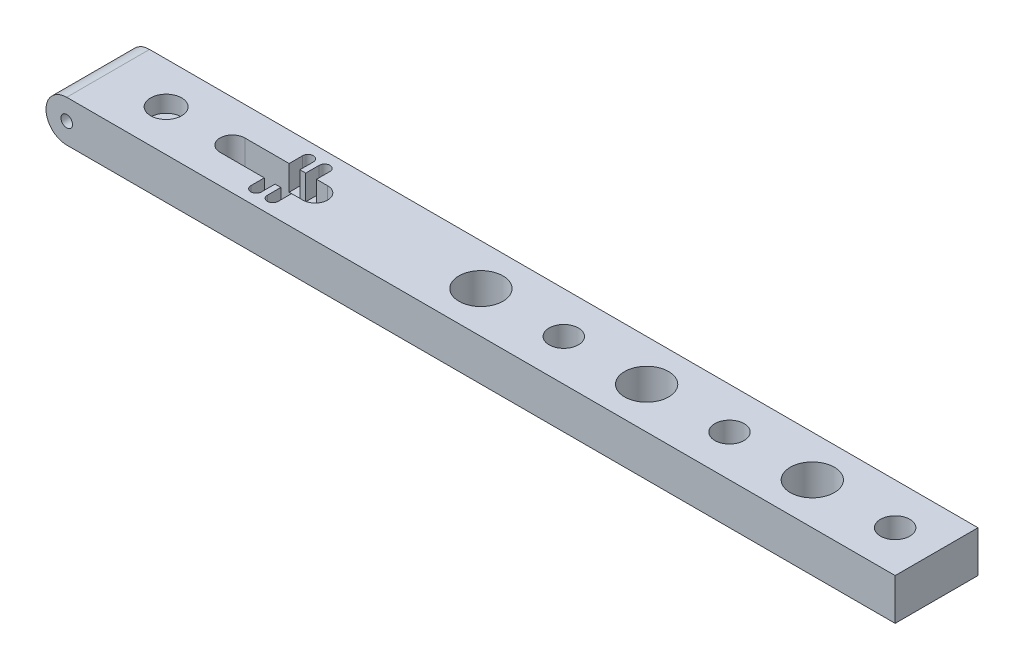
ISO-10303-21;
HEADER;
FILE_DESCRIPTION(('STEP AP214'),'2;1');
FILE_NAME('part.step','',(''),(''),'','','');
FILE_SCHEMA(('AUTOMOTIVE_DESIGN { 1 0 10303 214 1 1 1 1 }'));
ENDSEC;
DATA;
#1=APPLICATION_CONTEXT('core data for automotive mechanical design processes');
#2=APPLICATION_PROTOCOL_DEFINITION('international standard','automotive_design',2000,#1);
#3=PRODUCT_CONTEXT('',#1,'mechanical');
#4=PRODUCT('Part','Part','',(#3));
#5=PRODUCT_RELATED_PRODUCT_CATEGORY('part','',(#4));
#6=PRODUCT_DEFINITION_FORMATION('','',#4);
#7=PRODUCT_DEFINITION_CONTEXT('part definition',#1,'design');
#8=PRODUCT_DEFINITION('design','',#6,#7);
#9=PRODUCT_DEFINITION_SHAPE('','',#8);
#10=(LENGTH_UNIT() NAMED_UNIT(*) SI_UNIT(.MILLI.,.METRE.));
#11=(NAMED_UNIT(*) PLANE_ANGLE_UNIT() SI_UNIT($,.RADIAN.));
#12=(NAMED_UNIT(*) SI_UNIT($,.STERADIAN.) SOLID_ANGLE_UNIT());
#13=UNCERTAINTY_MEASURE_WITH_UNIT(LENGTH_MEASURE(1.E-05),#10,'distance_accuracy_value','');
#14=(GEOMETRIC_REPRESENTATION_CONTEXT(3) GLOBAL_UNCERTAINTY_ASSIGNED_CONTEXT((#13)) GLOBAL_UNIT_ASSIGNED_CONTEXT((#10,
#11,#12)) REPRESENTATION_CONTEXT('',''));
#15=CARTESIAN_POINT('',(0.,0.,0.));
#16=DIRECTION('',(0.,0.,1.));
#17=DIRECTION('',(1.,0.,0.));
#18=AXIS2_PLACEMENT_3D('',#15,#16,#17);
#19=CARTESIAN_POINT('',(8.89,6.35,6.35));
#20=DIRECTION('',(0.,1.,0.));
#21=DIRECTION('',(0.,0.,1.));
#22=AXIS2_PLACEMENT_3D('',#19,#20,#21);
#23=CYLINDRICAL_SURFACE('',#22,0.888999999999999);
#24=CARTESIAN_POINT('',(8.89,0.,6.35));
#25=DIRECTION('',(0.,1.,0.));
#26=DIRECTION('',(0.,0.,1.));
#27=AXIS2_PLACEMENT_3D('',#24,#25,#26);
#28=CIRCLE('',#27,0.888999999999999);
#29=CARTESIAN_POINT('',(8.89,0.,7.239));
#30=VERTEX_POINT('',#29);
#31=EDGE_CURVE('E244',#30,#30,#28,.T.);
#32=ORIENTED_EDGE('',*,*,#31,.F.);
#33=EDGE_LOOP('',(#32));
#34=FACE_BOUND('',#33,.T.);
#35=CARTESIAN_POINT('',(8.89,3.81,6.35));
#36=DIRECTION('',(0.,1.,0.));
#37=DIRECTION('',(0.,0.,1.));
#38=AXIS2_PLACEMENT_3D('',#35,#36,#37);
#39=CIRCLE('',#38,0.888999999999999);
#40=CARTESIAN_POINT('',(8.89,3.81,7.239));
#41=VERTEX_POINT('',#40);
#42=EDGE_CURVE('E45',#41,#41,#39,.F.);
#43=ORIENTED_EDGE('',*,*,#42,.F.);
#44=EDGE_LOOP('',(#43));
#45=FACE_BOUND('',#44,.T.);
#46=ADVANCED_FACE('F41',(#34,#45),#23,.F.);
#47=CARTESIAN_POINT('',(0.,6.35,12.7));
#48=DIRECTION('',(0.,-1.,0.));
#49=DIRECTION('',(0.,0.,-1.));
#50=AXIS2_PLACEMENT_3D('',#47,#48,#49);
#51=PLANE('',#50);
#52=CARTESIAN_POINT('',(8.89,6.35,6.35));
#53=DIRECTION('',(0.,1.,0.));
#54=DIRECTION('',(0.,0.,1.));
#55=AXIS2_PLACEMENT_3D('',#52,#53,#54);
#56=CIRCLE('',#55,2.38125);
#57=CARTESIAN_POINT('',(8.89,6.35,8.73125));
#58=VERTEX_POINT('',#57);
#59=EDGE_CURVE('E532',#58,#58,#56,.T.);
#60=ORIENTED_EDGE('',*,*,#59,.F.);
#61=EDGE_LOOP('',(#60));
#62=FACE_BOUND('',#61,.T.);
#63=CARTESIAN_POINT('',(57.15,6.35,6.35));
#64=DIRECTION('',(0.,1.,0.));
#65=DIRECTION('',(0.,0.,1.));
#66=AXIS2_PLACEMENT_3D('',#63,#64,#65);
#67=CIRCLE('',#66,3.3782);
#68=CARTESIAN_POINT('',(57.15,6.35,9.7282));
#69=VERTEX_POINT('',#68);
#70=EDGE_CURVE('E522',#69,#69,#67,.T.);
#71=ORIENTED_EDGE('',*,*,#70,.F.);
#72=EDGE_LOOP('',(#71));
#73=FACE_BOUND('',#72,.T.);
#74=CARTESIAN_POINT('',(82.55,6.35,6.35));
#75=DIRECTION('',(0.,1.,0.));
#76=DIRECTION('',(0.,0.,1.));
#77=AXIS2_PLACEMENT_3D('',#74,#75,#76);
#78=CIRCLE('',#77,3.3782);
#79=CARTESIAN_POINT('',(82.55,6.35,9.7282));
#80=VERTEX_POINT('',#79);
#81=EDGE_CURVE('E514',#80,#80,#78,.T.);
#82=ORIENTED_EDGE('',*,*,#81,.F.);
#83=EDGE_LOOP('',(#82));
#84=FACE_BOUND('',#83,.T.);
#85=CARTESIAN_POINT('',(69.85,6.35,6.35));
#86=DIRECTION('',(0.,1.,0.));
#87=DIRECTION('',(0.,0.,1.));
#88=AXIS2_PLACEMENT_3D('',#85,#86,#87);
#89=CIRCLE('',#88,2.2479);
#90=CARTESIAN_POINT('',(69.85,6.35,8.5979));
#91=VERTEX_POINT('',#90);
#92=EDGE_CURVE('E506',#91,#91,#89,.T.);
#93=ORIENTED_EDGE('',*,*,#92,.F.);
#94=EDGE_LOOP('',(#93));
#95=FACE_BOUND('',#94,.T.);
#96=CARTESIAN_POINT('',(95.25,6.35,6.35));
#97=DIRECTION('',(0.,1.,0.));
#98=DIRECTION('',(0.,0.,1.));
#99=AXIS2_PLACEMENT_3D('',#96,#97,#98);
#100=CIRCLE('',#99,2.2479);
#101=CARTESIAN_POINT('',(95.25,6.35,8.5979));
#102=VERTEX_POINT('',#101);
#103=EDGE_CURVE('E498',#102,#102,#100,.T.);
#104=ORIENTED_EDGE('',*,*,#103,.F.);
#105=EDGE_LOOP('',(#104));
#106=FACE_BOUND('',#105,.T.);
#107=DIRECTION('',(-1.,0.,0.));
#108=VECTOR('',#107,1.);
#109=CARTESIAN_POINT('',(19.05,6.35,4.445));
#110=LINE('',#109,#108);
#111=CARTESIAN_POINT('',(28.3845,6.35,4.445));
#112=VERTEX_POINT('',#111);
#113=CARTESIAN_POINT('',(27.4955,6.35,4.445));
#114=VERTEX_POINT('',#113);
#115=EDGE_CURVE('E371',#112,#114,#110,.T.);
#116=ORIENTED_EDGE('',*,*,#115,.F.);
#117=DIRECTION('',(0.,0.,1.));
#118=VECTOR('',#117,1.);
#119=CARTESIAN_POINT('',(28.3845,6.35,10.31875));
#120=LINE('',#119,#118);
#121=CARTESIAN_POINT('',(28.3845,6.35,2.38125));
#122=VERTEX_POINT('',#121);
#123=EDGE_CURVE('E237',#122,#112,#120,.T.);
#124=ORIENTED_EDGE('',*,*,#123,.F.);
#125=CARTESIAN_POINT('',(29.21,6.35,2.38125));
#126=DIRECTION('',(0.,1.,0.));
#127=DIRECTION('',(0.,0.,1.));
#128=AXIS2_PLACEMENT_3D('',#125,#126,#127);
#129=CIRCLE('',#128,0.8255);
#130=CARTESIAN_POINT('',(30.0355,6.35,2.38125));
#131=VERTEX_POINT('',#130);
#132=EDGE_CURVE('E258',#131,#122,#129,.T.);
#133=ORIENTED_EDGE('',*,*,#132,.F.);
#134=DIRECTION('',(0.,0.,-1.));
#135=VECTOR('',#134,1.);
#136=CARTESIAN_POINT('',(30.0355,6.35,10.31875));
#137=LINE('',#136,#135);
#138=CARTESIAN_POINT('',(30.0355,6.35,4.445));
#139=VERTEX_POINT('',#138);
#140=EDGE_CURVE('E253',#139,#131,#137,.T.);
#141=ORIENTED_EDGE('',*,*,#140,.F.);
#142=CARTESIAN_POINT('',(31.75,6.35,4.445));
#143=VERTEX_POINT('',#142);
#144=EDGE_CURVE('E342',#143,#139,#110,.T.);
#145=ORIENTED_EDGE('',*,*,#144,.F.);
#146=CARTESIAN_POINT('',(31.75,6.35,6.35));
#147=DIRECTION('',(0.,1.,0.));
#148=DIRECTION('',(0.,0.,1.));
#149=AXIS2_PLACEMENT_3D('',#146,#147,#148);
#150=CIRCLE('',#149,1.905);
#151=CARTESIAN_POINT('',(31.75,6.35,8.255));
#152=VERTEX_POINT('',#151);
#153=EDGE_CURVE('E362',#152,#143,#150,.T.);
#154=ORIENTED_EDGE('',*,*,#153,.F.);
#155=DIRECTION('',(1.,0.,0.));
#156=VECTOR('',#155,1.);
#157=CARTESIAN_POINT('',(19.05,6.35,8.255));
#158=LINE('',#157,#156);
#159=CARTESIAN_POINT('',(30.0355,6.35,8.255));
#160=VERTEX_POINT('',#159);
#161=EDGE_CURVE('E357',#160,#152,#158,.T.);
#162=ORIENTED_EDGE('',*,*,#161,.F.);
#163=CARTESIAN_POINT('',(30.0355,6.35,10.31875));
#164=VERTEX_POINT('',#163);
#165=EDGE_CURVE('E255',#164,#160,#137,.T.);
#166=ORIENTED_EDGE('',*,*,#165,.F.);
#167=CARTESIAN_POINT('',(29.21,6.35,10.31875));
#168=DIRECTION('',(0.,1.,0.));
#169=DIRECTION('',(0.,0.,1.));
#170=AXIS2_PLACEMENT_3D('',#167,#168,#169);
#171=CIRCLE('',#170,0.8255);
#172=CARTESIAN_POINT('',(28.3845,6.35,10.31875));
#173=VERTEX_POINT('',#172);
#174=EDGE_CURVE('E216',#173,#164,#171,.T.);
#175=ORIENTED_EDGE('',*,*,#174,.F.);
#176=CARTESIAN_POINT('',(28.3845,6.35,8.255));
#177=VERTEX_POINT('',#176);
#178=EDGE_CURVE('E241',#177,#173,#120,.T.);
#179=ORIENTED_EDGE('',*,*,#178,.F.);
#180=CARTESIAN_POINT('',(27.4955,6.35,8.255));
#181=VERTEX_POINT('',#180);
#182=EDGE_CURVE('E363',#181,#177,#158,.T.);
#183=ORIENTED_EDGE('',*,*,#182,.F.);
#184=DIRECTION('',(0.,0.,-1.));
#185=VECTOR('',#184,1.);
#186=CARTESIAN_POINT('',(27.4955,6.35,10.31875));
#187=LINE('',#186,#185);
#188=CARTESIAN_POINT('',(27.4955,6.35,10.31875));
#189=VERTEX_POINT('',#188);
#190=EDGE_CURVE('E293',#189,#181,#187,.T.);
#191=ORIENTED_EDGE('',*,*,#190,.F.);
#192=CARTESIAN_POINT('',(26.67,6.35,10.31875));
#193=DIRECTION('',(0.,1.,0.));
#194=DIRECTION('',(0.,0.,1.));
#195=AXIS2_PLACEMENT_3D('',#192,#193,#194);
#196=CIRCLE('',#195,0.8255);
#197=CARTESIAN_POINT('',(25.8445,6.35,10.31875));
#198=VERTEX_POINT('',#197);
#199=EDGE_CURVE('E288',#198,#189,#196,.T.);
#200=ORIENTED_EDGE('',*,*,#199,.F.);
#201=DIRECTION('',(0.,0.,1.));
#202=VECTOR('',#201,1.);
#203=CARTESIAN_POINT('',(25.8445,6.35,10.31875));
#204=LINE('',#203,#202);
#205=CARTESIAN_POINT('',(25.8445,6.35,8.255));
#206=VERTEX_POINT('',#205);
#207=EDGE_CURVE('E300',#206,#198,#204,.T.);
#208=ORIENTED_EDGE('',*,*,#207,.F.);
#209=CARTESIAN_POINT('',(19.05,6.35,8.255));
#210=VERTEX_POINT('',#209);
#211=EDGE_CURVE('E358',#210,#206,#158,.T.);
#212=ORIENTED_EDGE('',*,*,#211,.F.);
#213=CARTESIAN_POINT('',(19.05,6.35,6.35));
#214=DIRECTION('',(0.,1.,0.));
#215=DIRECTION('',(0.,0.,1.));
#216=AXIS2_PLACEMENT_3D('',#213,#214,#215);
#217=CIRCLE('',#216,1.905);
#218=CARTESIAN_POINT('',(19.05,6.35,4.445));
#219=VERTEX_POINT('',#218);
#220=EDGE_CURVE('E336',#219,#210,#217,.T.);
#221=ORIENTED_EDGE('',*,*,#220,.F.);
#222=CARTESIAN_POINT('',(25.8445,6.35,4.445));
#223=VERTEX_POINT('',#222);
#224=EDGE_CURVE('E367',#223,#219,#110,.T.);
#225=ORIENTED_EDGE('',*,*,#224,.F.);
#226=CARTESIAN_POINT('',(25.8445,6.35,2.38125));
#227=VERTEX_POINT('',#226);
#228=EDGE_CURVE('E277',#227,#223,#204,.T.);
#229=ORIENTED_EDGE('',*,*,#228,.F.);
#230=CARTESIAN_POINT('',(26.67,6.35,2.38125));
#231=DIRECTION('',(0.,1.,0.));
#232=DIRECTION('',(0.,0.,1.));
#233=AXIS2_PLACEMENT_3D('',#230,#231,#232);
#234=CIRCLE('',#233,0.8255);
#235=CARTESIAN_POINT('',(27.4955,6.35,2.38125));
#236=VERTEX_POINT('',#235);
#237=EDGE_CURVE('E296',#236,#227,#234,.T.);
#238=ORIENTED_EDGE('',*,*,#237,.F.);
#239=EDGE_CURVE('E292',#114,#236,#187,.T.);
#240=ORIENTED_EDGE('',*,*,#239,.F.);
#241=EDGE_LOOP('',(#116,#124,#133,#141,#145,#154,#162,#166,#175,#179,#183,#191,#200,#208,#212,
#221,#225,#229,#238,#240));
#242=FACE_BOUND('',#241,.T.);
#243=DIRECTION('',(-1.,0.,0.));
#244=VECTOR('',#243,1.);
#245=CARTESIAN_POINT('',(0.,6.35,0.));
#246=LINE('',#245,#244);
#247=CARTESIAN_POINT('',(127.,6.35,0.));
#248=VERTEX_POINT('',#247);
#249=CARTESIAN_POINT('',(0.,6.35,0.));
#250=VERTEX_POINT('',#249);
#251=EDGE_CURVE('E400',#248,#250,#246,.T.);
#252=ORIENTED_EDGE('',*,*,#251,.T.);
#253=DIRECTION('',(0.,0.,-1.));
#254=VECTOR('',#253,1.);
#255=CARTESIAN_POINT('',(0.,6.35,12.7));
#256=LINE('',#255,#254);
#257=CARTESIAN_POINT('',(0.,6.35,12.7));
#258=VERTEX_POINT('',#257);
#259=EDGE_CURVE('E409',#258,#250,#256,.T.);
#260=ORIENTED_EDGE('',*,*,#259,.F.);
#261=DIRECTION('',(-1.,0.,0.));
#262=VECTOR('',#261,1.);
#263=CARTESIAN_POINT('',(0.,6.35,12.7));
#264=LINE('',#263,#262);
#265=CARTESIAN_POINT('',(127.,6.35,12.7));
#266=VERTEX_POINT('',#265);
#267=EDGE_CURVE('E406',#266,#258,#264,.T.);
#268=ORIENTED_EDGE('',*,*,#267,.F.);
#269=DIRECTION('',(0.,0.,-1.));
#270=VECTOR('',#269,1.);
#271=CARTESIAN_POINT('',(127.,6.35,12.7));
#272=LINE('',#271,#270);
#273=EDGE_CURVE('E424',#266,#248,#272,.T.);
#274=ORIENTED_EDGE('',*,*,#273,.T.);
#275=EDGE_LOOP('',(#252,#260,#268,#274));
#276=FACE_BOUND('',#275,.T.);
#277=CARTESIAN_POINT('',(120.65,6.35,6.35));
#278=DIRECTION('',(0.,1.,0.));
#279=DIRECTION('',(0.,0.,1.));
#280=AXIS2_PLACEMENT_3D('',#277,#278,#279);
#281=CIRCLE('',#280,2.2479);
#282=CARTESIAN_POINT('',(120.65,6.35,8.5979));
#283=VERTEX_POINT('',#282);
#284=EDGE_CURVE('E483',#283,#283,#281,.T.);
#285=ORIENTED_EDGE('',*,*,#284,.F.);
#286=EDGE_LOOP('',(#285));
#287=FACE_BOUND('',#286,.T.);
#288=CARTESIAN_POINT('',(107.95,6.35,6.35));
#289=DIRECTION('',(0.,1.,0.));
#290=DIRECTION('',(0.,0.,1.));
#291=AXIS2_PLACEMENT_3D('',#288,#289,#290);
#292=CIRCLE('',#291,3.3782);
#293=CARTESIAN_POINT('',(107.95,6.35,9.7282));
#294=VERTEX_POINT('',#293);
#295=EDGE_CURVE('E490',#294,#294,#292,.T.);
#296=ORIENTED_EDGE('',*,*,#295,.F.);
#297=EDGE_LOOP('',(#296));
#298=FACE_BOUND('',#297,.T.);
#299=ADVANCED_FACE('F459',(#62,#73,#84,#95,#106,#242,#276,#287,#298),#51,.F.);
#300=CARTESIAN_POINT('',(0.,3.175,12.7));
#301=DIRECTION('',(0.,0.,-1.));
#302=DIRECTION('',(-1.,0.,0.));
#303=AXIS2_PLACEMENT_3D('',#300,#301,#302);
#304=CYLINDRICAL_SURFACE('',#303,3.175);
#305=CARTESIAN_POINT('',(0.,3.175,0.));
#306=DIRECTION('',(0.,0.,1.));
#307=DIRECTION('',(1.,0.,0.));
#308=AXIS2_PLACEMENT_3D('',#305,#306,#307);
#309=CIRCLE('',#308,3.175);
#310=CARTESIAN_POINT('',(0.,0.,0.));
#311=VERTEX_POINT('',#310);
#312=EDGE_CURVE('E394',#250,#311,#309,.T.);
#313=ORIENTED_EDGE('',*,*,#312,.T.);
#314=DIRECTION('',(0.,0.,-1.));
#315=VECTOR('',#314,1.);
#316=CARTESIAN_POINT('',(0.,0.,12.7));
#317=LINE('',#316,#315);
#318=CARTESIAN_POINT('',(0.,0.,12.7));
#319=VERTEX_POINT('',#318);
#320=EDGE_CURVE('E432',#319,#311,#317,.T.);
#321=ORIENTED_EDGE('',*,*,#320,.F.);
#322=CARTESIAN_POINT('',(0.,3.175,12.7));
#323=DIRECTION('',(0.,0.,1.));
#324=DIRECTION('',(1.,0.,0.));
#325=AXIS2_PLACEMENT_3D('',#322,#323,#324);
#326=CIRCLE('',#325,3.175);
#327=EDGE_CURVE('E395',#258,#319,#326,.T.);
#328=ORIENTED_EDGE('',*,*,#327,.F.);
#329=ORIENTED_EDGE('',*,*,#259,.T.);
#330=EDGE_LOOP('',(#313,#321,#328,#329));
#331=FACE_BOUND('',#330,.T.);
#332=ADVANCED_FACE('F43',(#331),#304,.T.);
#333=CARTESIAN_POINT('',(0.,0.,12.7));
#334=DIRECTION('',(0.,1.,0.));
#335=DIRECTION('',(0.,0.,1.));
#336=AXIS2_PLACEMENT_3D('',#333,#334,#335);
#337=PLANE('',#336);
#338=CARTESIAN_POINT('',(57.15,0.,6.35));
#339=DIRECTION('',(0.,1.,0.));
#340=DIRECTION('',(0.,0.,1.));
#341=AXIS2_PLACEMENT_3D('',#338,#339,#340);
#342=CIRCLE('',#341,3.3782);
#343=CARTESIAN_POINT('',(57.15,0.,9.7282));
#344=VERTEX_POINT('',#343);
#345=EDGE_CURVE('E518',#344,#344,#342,.T.);
#346=ORIENTED_EDGE('',*,*,#345,.T.);
#347=EDGE_LOOP('',(#346));
#348=FACE_BOUND('',#347,.T.);
#349=CARTESIAN_POINT('',(82.55,0.,6.35));
#350=DIRECTION('',(0.,1.,0.));
#351=DIRECTION('',(0.,0.,1.));
#352=AXIS2_PLACEMENT_3D('',#349,#350,#351);
#353=CIRCLE('',#352,3.3782);
#354=CARTESIAN_POINT('',(82.55,0.,9.7282));
#355=VERTEX_POINT('',#354);
#356=EDGE_CURVE('E510',#355,#355,#353,.T.);
#357=ORIENTED_EDGE('',*,*,#356,.T.);
#358=EDGE_LOOP('',(#357));
#359=FACE_BOUND('',#358,.T.);
#360=CARTESIAN_POINT('',(69.85,0.,6.35));
#361=DIRECTION('',(0.,1.,0.));
#362=DIRECTION('',(0.,0.,1.));
#363=AXIS2_PLACEMENT_3D('',#360,#361,#362);
#364=CIRCLE('',#363,2.2479);
#365=CARTESIAN_POINT('',(69.85,0.,8.5979));
#366=VERTEX_POINT('',#365);
#367=EDGE_CURVE('E502',#366,#366,#364,.T.);
#368=ORIENTED_EDGE('',*,*,#367,.T.);
#369=EDGE_LOOP('',(#368));
#370=FACE_BOUND('',#369,.T.);
#371=CARTESIAN_POINT('',(95.25,0.,6.35));
#372=DIRECTION('',(0.,1.,0.));
#373=DIRECTION('',(0.,0.,1.));
#374=AXIS2_PLACEMENT_3D('',#371,#372,#373);
#375=CIRCLE('',#374,2.2479);
#376=CARTESIAN_POINT('',(95.25,0.,8.5979));
#377=VERTEX_POINT('',#376);
#378=EDGE_CURVE('E494',#377,#377,#375,.T.);
#379=ORIENTED_EDGE('',*,*,#378,.T.);
#380=EDGE_LOOP('',(#379));
#381=FACE_BOUND('',#380,.T.);
#382=CARTESIAN_POINT('',(107.95,0.,6.35));
#383=DIRECTION('',(0.,1.,0.));
#384=DIRECTION('',(0.,0.,1.));
#385=AXIS2_PLACEMENT_3D('',#382,#383,#384);
#386=CIRCLE('',#385,3.3782);
#387=CARTESIAN_POINT('',(107.95,0.,9.7282));
#388=VERTEX_POINT('',#387);
#389=EDGE_CURVE('E486',#388,#388,#386,.T.);
#390=ORIENTED_EDGE('',*,*,#389,.T.);
#391=EDGE_LOOP('',(#390));
#392=FACE_BOUND('',#391,.T.);
#393=CARTESIAN_POINT('',(120.65,0.,6.35));
#394=DIRECTION('',(0.,1.,0.));
#395=DIRECTION('',(0.,0.,1.));
#396=AXIS2_PLACEMENT_3D('',#393,#394,#395);
#397=CIRCLE('',#396,2.2479);
#398=CARTESIAN_POINT('',(120.65,0.,8.5979));
#399=VERTEX_POINT('',#398);
#400=EDGE_CURVE('E480',#399,#399,#397,.T.);
#401=ORIENTED_EDGE('',*,*,#400,.T.);
#402=EDGE_LOOP('',(#401));
#403=FACE_BOUND('',#402,.T.);
#404=ORIENTED_EDGE('',*,*,#31,.T.);
#405=EDGE_LOOP('',(#404));
#406=FACE_BOUND('',#405,.T.);
#407=DIRECTION('',(-1.,0.,0.));
#408=VECTOR('',#407,1.);
#409=CARTESIAN_POINT('',(19.05,0.,4.445));
#410=LINE('',#409,#408);
#411=CARTESIAN_POINT('',(31.75,0.,4.445));
#412=VERTEX_POINT('',#411);
#413=CARTESIAN_POINT('',(19.05,0.,4.445));
#414=VERTEX_POINT('',#413);
#415=EDGE_CURVE('E350',#412,#414,#410,.T.);
#416=ORIENTED_EDGE('',*,*,#415,.T.);
#417=CARTESIAN_POINT('',(19.05,0.,6.35));
#418=DIRECTION('',(0.,1.,0.));
#419=DIRECTION('',(0.,0.,1.));
#420=AXIS2_PLACEMENT_3D('',#417,#418,#419);
#421=CIRCLE('',#420,1.905);
#422=CARTESIAN_POINT('',(19.05,0.,8.255));
#423=VERTEX_POINT('',#422);
#424=EDGE_CURVE('E337',#414,#423,#421,.T.);
#425=ORIENTED_EDGE('',*,*,#424,.T.);
#426=DIRECTION('',(1.,0.,0.));
#427=VECTOR('',#426,1.);
#428=CARTESIAN_POINT('',(19.05,0.,8.255));
#429=LINE('',#428,#427);
#430=CARTESIAN_POINT('',(31.75,0.,8.255));
#431=VERTEX_POINT('',#430);
#432=EDGE_CURVE('E341',#423,#431,#429,.T.);
#433=ORIENTED_EDGE('',*,*,#432,.T.);
#434=CARTESIAN_POINT('',(31.75,0.,6.35));
#435=DIRECTION('',(0.,1.,0.));
#436=DIRECTION('',(0.,0.,1.));
#437=AXIS2_PLACEMENT_3D('',#434,#435,#436);
#438=CIRCLE('',#437,1.905);
#439=EDGE_CURVE('E346',#431,#412,#438,.T.);
#440=ORIENTED_EDGE('',*,*,#439,.T.);
#441=EDGE_LOOP('',(#416,#425,#433,#440));
#442=FACE_BOUND('',#441,.T.);
#443=DIRECTION('',(1.,0.,0.));
#444=VECTOR('',#443,1.);
#445=CARTESIAN_POINT('',(0.,0.,0.));
#446=LINE('',#445,#444);
#447=CARTESIAN_POINT('',(127.,0.,0.));
#448=VERTEX_POINT('',#447);
#449=EDGE_CURVE('E413',#311,#448,#446,.T.);
#450=ORIENTED_EDGE('',*,*,#449,.T.);
#451=DIRECTION('',(0.,0.,-1.));
#452=VECTOR('',#451,1.);
#453=CARTESIAN_POINT('',(127.,0.,12.7));
#454=LINE('',#453,#452);
#455=CARTESIAN_POINT('',(127.,0.,12.7));
#456=VERTEX_POINT('',#455);
#457=EDGE_CURVE('E428',#456,#448,#454,.T.);
#458=ORIENTED_EDGE('',*,*,#457,.F.);
#459=DIRECTION('',(1.,0.,0.));
#460=VECTOR('',#459,1.);
#461=CARTESIAN_POINT('',(0.,0.,12.7));
#462=LINE('',#461,#460);
#463=EDGE_CURVE('E399',#319,#456,#462,.T.);
#464=ORIENTED_EDGE('',*,*,#463,.F.);
#465=ORIENTED_EDGE('',*,*,#320,.T.);
#466=EDGE_LOOP('',(#450,#458,#464,#465));
#467=FACE_BOUND('',#466,.T.);
#468=ADVANCED_FACE('F649',(#348,#359,#370,#381,#392,#403,#406,#442,#467),#337,.F.);
#469=CARTESIAN_POINT('',(127.,0.,12.7));
#470=DIRECTION('',(-1.,0.,0.));
#471=DIRECTION('',(0.,0.,1.));
#472=AXIS2_PLACEMENT_3D('',#469,#470,#471);
#473=PLANE('',#472);
#474=DIRECTION('',(0.,1.,0.));
#475=VECTOR('',#474,1.);
#476=CARTESIAN_POINT('',(127.,0.,0.));
#477=LINE('',#476,#475);
#478=EDGE_CURVE('E416',#448,#248,#477,.T.);
#479=ORIENTED_EDGE('',*,*,#478,.T.);
#480=ORIENTED_EDGE('',*,*,#273,.F.);
#481=DIRECTION('',(0.,1.,0.));
#482=VECTOR('',#481,1.);
#483=CARTESIAN_POINT('',(127.,0.,12.7));
#484=LINE('',#483,#482);
#485=EDGE_CURVE('E403',#456,#266,#484,.T.);
#486=ORIENTED_EDGE('',*,*,#485,.F.);
#487=ORIENTED_EDGE('',*,*,#457,.T.);
#488=EDGE_LOOP('',(#479,#480,#486,#487));
#489=FACE_BOUND('',#488,.T.);
#490=ADVANCED_FACE('F643',(#489),#473,.F.);
#491=CARTESIAN_POINT('',(0.,3.175,12.7));
#492=DIRECTION('',(0.,0.,1.));
#493=DIRECTION('',(1.,0.,0.));
#494=AXIS2_PLACEMENT_3D('',#491,#492,#493);
#495=PLANE('',#494);
#496=CARTESIAN_POINT('',(0.,3.175,12.7));
#497=DIRECTION('',(0.,0.,1.));
#498=DIRECTION('',(1.,0.,0.));
#499=AXIS2_PLACEMENT_3D('',#496,#497,#498);
#500=CIRCLE('',#499,0.888999999999989);
#501=CARTESIAN_POINT('',(0.888999999999989,3.175,12.7));
#502=VERTEX_POINT('',#501);
#503=EDGE_CURVE('E376',#502,#502,#500,.T.);
#504=ORIENTED_EDGE('',*,*,#503,.F.);
#505=EDGE_LOOP('',(#504));
#506=FACE_BOUND('',#505,.T.);
#507=ORIENTED_EDGE('',*,*,#327,.T.);
#508=ORIENTED_EDGE('',*,*,#463,.T.);
#509=ORIENTED_EDGE('',*,*,#485,.T.);
#510=ORIENTED_EDGE('',*,*,#267,.T.);
#511=EDGE_LOOP('',(#507,#508,#509,#510));
#512=FACE_BOUND('',#511,.T.);
#513=ADVANCED_FACE('F640',(#506,#512),#495,.T.);
#514=CARTESIAN_POINT('',(0.,3.175,0.));
#515=DIRECTION('',(0.,0.,1.));
#516=DIRECTION('',(1.,0.,0.));
#517=AXIS2_PLACEMENT_3D('',#514,#515,#516);
#518=PLANE('',#517);
#519=ORIENTED_EDGE('',*,*,#312,.F.);
#520=ORIENTED_EDGE('',*,*,#251,.F.);
#521=ORIENTED_EDGE('',*,*,#478,.F.);
#522=ORIENTED_EDGE('',*,*,#449,.F.);
#523=EDGE_LOOP('',(#519,#520,#521,#522));
#524=FACE_BOUND('',#523,.T.);
#525=ADVANCED_FACE('F638',(#524),#518,.F.);
#526=CARTESIAN_POINT('',(0.,3.175,9.525));
#527=DIRECTION('',(0.,0.,1.));
#528=DIRECTION('',(1.,0.,0.));
#529=AXIS2_PLACEMENT_3D('',#526,#527,#528);
#530=CONICAL_SURFACE('',#529,0.888999999999999,1.02974425867665);
#531=CARTESIAN_POINT('',(0.,3.175,8.9908349096845));
#532=VERTEX_POINT('',#531);
#533=VERTEX_LOOP('',#532);
#534=FACE_BOUND('',#533,.T.);
#535=CARTESIAN_POINT('',(0.,3.175,9.525));
#536=DIRECTION('',(0.,0.,1.));
#537=DIRECTION('',(1.,0.,0.));
#538=AXIS2_PLACEMENT_3D('',#535,#536,#537);
#539=CIRCLE('',#538,0.888999999999999);
#540=CARTESIAN_POINT('',(0.888999999999999,3.175,9.525));
#541=VERTEX_POINT('',#540);
#542=EDGE_CURVE('E390',#541,#541,#539,.T.);
#543=ORIENTED_EDGE('',*,*,#542,.T.);
#544=EDGE_LOOP('',(#543));
#545=FACE_BOUND('',#544,.T.);
#546=ADVANCED_FACE('F634',(#534,#545),#530,.F.);
#547=CARTESIAN_POINT('',(0.,3.175,12.7));
#548=DIRECTION('',(0.,0.,1.));
#549=DIRECTION('',(1.,0.,0.));
#550=AXIS2_PLACEMENT_3D('',#547,#548,#549);
#551=CYLINDRICAL_SURFACE('',#550,0.888999999999994);
#552=ORIENTED_EDGE('',*,*,#542,.F.);
#553=EDGE_LOOP('',(#552));
#554=FACE_BOUND('',#553,.T.);
#555=ORIENTED_EDGE('',*,*,#503,.T.);
#556=EDGE_LOOP('',(#555));
#557=FACE_BOUND('',#556,.T.);
#558=ADVANCED_FACE('F630',(#554,#557),#551,.F.);
#559=CARTESIAN_POINT('',(19.05,0.,6.35));
#560=DIRECTION('',(0.,1.,0.));
#561=DIRECTION('',(0.,0.,1.));
#562=AXIS2_PLACEMENT_3D('',#559,#560,#561);
#563=CYLINDRICAL_SURFACE('',#562,1.905);
#564=ORIENTED_EDGE('',*,*,#220,.T.);
#565=DIRECTION('',(0.,1.,0.));
#566=VECTOR('',#565,1.);
#567=CARTESIAN_POINT('',(19.05,0.,8.255));
#568=LINE('',#567,#566);
#569=EDGE_CURVE('E354',#423,#210,#568,.T.);
#570=ORIENTED_EDGE('',*,*,#569,.F.);
#571=ORIENTED_EDGE('',*,*,#424,.F.);
#572=DIRECTION('',(0.,1.,0.));
#573=VECTOR('',#572,1.);
#574=CARTESIAN_POINT('',(19.05,0.,4.445));
#575=LINE('',#574,#573);
#576=EDGE_CURVE('E372',#414,#219,#575,.T.);
#577=ORIENTED_EDGE('',*,*,#576,.T.);
#578=EDGE_LOOP('',(#564,#570,#571,#577));
#579=FACE_BOUND('',#578,.T.);
#580=ADVANCED_FACE('F621',(#579),#563,.F.);
#581=CARTESIAN_POINT('',(19.05,0.,4.445));
#582=DIRECTION('',(0.,0.,-1.));
#583=DIRECTION('',(-1.,0.,0.));
#584=AXIS2_PLACEMENT_3D('',#581,#582,#583);
#585=PLANE('',#584);
#586=DIRECTION('',(1.,0.,0.));
#587=VECTOR('',#586,1.);
#588=CARTESIAN_POINT('',(19.05,2.54,4.445));
#589=LINE('',#588,#587);
#590=CARTESIAN_POINT('',(28.3845,2.54,4.445));
#591=VERTEX_POINT('',#590);
#592=CARTESIAN_POINT('',(30.0355,2.54,4.445));
#593=VERTEX_POINT('',#592);
#594=EDGE_CURVE('E325',#591,#593,#589,.T.);
#595=ORIENTED_EDGE('',*,*,#594,.F.);
#596=DIRECTION('',(0.,1.,0.));
#597=VECTOR('',#596,1.);
#598=CARTESIAN_POINT('',(28.3845,0.,4.445));
#599=LINE('',#598,#597);
#600=EDGE_CURVE('E332',#591,#112,#599,.T.);
#601=ORIENTED_EDGE('',*,*,#600,.T.);
#602=ORIENTED_EDGE('',*,*,#115,.T.);
#603=DIRECTION('',(0.,-1.,0.));
#604=VECTOR('',#603,1.);
#605=CARTESIAN_POINT('',(27.4955,0.,4.445));
#606=LINE('',#605,#604);
#607=CARTESIAN_POINT('',(27.4955,2.54,4.445));
#608=VERTEX_POINT('',#607);
#609=EDGE_CURVE('E317',#114,#608,#606,.T.);
#610=ORIENTED_EDGE('',*,*,#609,.T.);
#611=DIRECTION('',(1.,0.,0.));
#612=VECTOR('',#611,1.);
#613=CARTESIAN_POINT('',(19.05,2.54,4.445));
#614=LINE('',#613,#612);
#615=CARTESIAN_POINT('',(25.8445,2.54,4.445));
#616=VERTEX_POINT('',#615);
#617=EDGE_CURVE('E265',#616,#608,#614,.T.);
#618=ORIENTED_EDGE('',*,*,#617,.F.);
#619=DIRECTION('',(0.,1.,0.));
#620=VECTOR('',#619,1.);
#621=CARTESIAN_POINT('',(25.8445,0.,4.445));
#622=LINE('',#621,#620);
#623=EDGE_CURVE('E321',#616,#223,#622,.T.);
#624=ORIENTED_EDGE('',*,*,#623,.T.);
#625=ORIENTED_EDGE('',*,*,#224,.T.);
#626=ORIENTED_EDGE('',*,*,#576,.F.);
#627=ORIENTED_EDGE('',*,*,#415,.F.);
#628=DIRECTION('',(0.,1.,0.));
#629=VECTOR('',#628,1.);
#630=CARTESIAN_POINT('',(31.75,0.,4.445));
#631=LINE('',#630,#629);
#632=EDGE_CURVE('E377',#412,#143,#631,.T.);
#633=ORIENTED_EDGE('',*,*,#632,.T.);
#634=ORIENTED_EDGE('',*,*,#144,.T.);
#635=DIRECTION('',(0.,-1.,0.));
#636=VECTOR('',#635,1.);
#637=CARTESIAN_POINT('',(30.0355,0.,4.445));
#638=LINE('',#637,#636);
#639=EDGE_CURVE('E328',#139,#593,#638,.T.);
#640=ORIENTED_EDGE('',*,*,#639,.T.);
#641=EDGE_LOOP('',(#595,#601,#602,#610,#618,#624,#625,#626,#627,#633,#634,#640));
#642=FACE_BOUND('',#641,.T.);
#643=ADVANCED_FACE('F617',(#642),#585,.F.);
#644=CARTESIAN_POINT('',(31.75,0.,6.35));
#645=DIRECTION('',(0.,1.,0.));
#646=DIRECTION('',(0.,0.,1.));
#647=AXIS2_PLACEMENT_3D('',#644,#645,#646);
#648=CYLINDRICAL_SURFACE('',#647,1.905);
#649=ORIENTED_EDGE('',*,*,#153,.T.);
#650=ORIENTED_EDGE('',*,*,#632,.F.);
#651=ORIENTED_EDGE('',*,*,#439,.F.);
#652=DIRECTION('',(0.,1.,0.));
#653=VECTOR('',#652,1.);
#654=CARTESIAN_POINT('',(31.75,0.,8.255));
#655=LINE('',#654,#653);
#656=EDGE_CURVE('E380',#431,#152,#655,.T.);
#657=ORIENTED_EDGE('',*,*,#656,.T.);
#658=EDGE_LOOP('',(#649,#650,#651,#657));
#659=FACE_BOUND('',#658,.T.);
#660=ADVANCED_FACE('F620',(#659),#648,.F.);
#661=CARTESIAN_POINT('',(19.05,0.,8.255));
#662=DIRECTION('',(0.,0.,1.));
#663=DIRECTION('',(1.,0.,0.));
#664=AXIS2_PLACEMENT_3D('',#661,#662,#663);
#665=PLANE('',#664);
#666=ORIENTED_EDGE('',*,*,#182,.T.);
#667=DIRECTION('',(0.,-1.,0.));
#668=VECTOR('',#667,1.);
#669=CARTESIAN_POINT('',(28.3845,0.,8.255));
#670=LINE('',#669,#668);
#671=CARTESIAN_POINT('',(28.3845,2.54,8.255));
#672=VERTEX_POINT('',#671);
#673=EDGE_CURVE('E11',#177,#672,#670,.T.);
#674=ORIENTED_EDGE('',*,*,#673,.T.);
#675=DIRECTION('',(-1.,0.,0.));
#676=VECTOR('',#675,1.);
#677=CARTESIAN_POINT('',(19.05,2.54,8.255));
#678=LINE('',#677,#676);
#679=CARTESIAN_POINT('',(30.0355,2.54,8.255));
#680=VERTEX_POINT('',#679);
#681=EDGE_CURVE('E447',#680,#672,#678,.T.);
#682=ORIENTED_EDGE('',*,*,#681,.F.);
#683=DIRECTION('',(0.,1.,0.));
#684=VECTOR('',#683,1.);
#685=CARTESIAN_POINT('',(30.0355,0.,8.255));
#686=LINE('',#685,#684);
#687=EDGE_CURVE('E51',#680,#160,#686,.T.);
#688=ORIENTED_EDGE('',*,*,#687,.T.);
#689=ORIENTED_EDGE('',*,*,#161,.T.);
#690=ORIENTED_EDGE('',*,*,#656,.F.);
#691=ORIENTED_EDGE('',*,*,#432,.F.);
#692=ORIENTED_EDGE('',*,*,#569,.T.);
#693=ORIENTED_EDGE('',*,*,#211,.T.);
#694=DIRECTION('',(0.,-1.,0.));
#695=VECTOR('',#694,1.);
#696=CARTESIAN_POINT('',(25.8445,0.,8.255));
#697=LINE('',#696,#695);
#698=CARTESIAN_POINT('',(25.8445,2.54,8.255));
#699=VERTEX_POINT('',#698);
#700=EDGE_CURVE('E443',#206,#699,#697,.T.);
#701=ORIENTED_EDGE('',*,*,#700,.T.);
#702=DIRECTION('',(-1.,0.,0.));
#703=VECTOR('',#702,1.);
#704=CARTESIAN_POINT('',(19.05,2.54,8.255));
#705=LINE('',#704,#703);
#706=CARTESIAN_POINT('',(27.4955,2.54,8.255));
#707=VERTEX_POINT('',#706);
#708=EDGE_CURVE('E436',#707,#699,#705,.T.);
#709=ORIENTED_EDGE('',*,*,#708,.F.);
#710=DIRECTION('',(0.,1.,0.));
#711=VECTOR('',#710,1.);
#712=CARTESIAN_POINT('',(27.4955,0.,8.255));
#713=LINE('',#712,#711);
#714=EDGE_CURVE('E439',#707,#181,#713,.T.);
#715=ORIENTED_EDGE('',*,*,#714,.T.);
#716=EDGE_LOOP('',(#666,#674,#682,#688,#689,#690,#691,#692,#693,#701,#709,#715));
#717=FACE_BOUND('',#716,.T.);
#718=ADVANCED_FACE('F454',(#717),#665,.F.);
#719=CARTESIAN_POINT('',(26.67,2.54,10.31875));
#720=DIRECTION('',(0.,1.,0.));
#721=DIRECTION('',(0.,0.,1.));
#722=AXIS2_PLACEMENT_3D('',#719,#720,#721);
#723=PLANE('',#722);
#724=ORIENTED_EDGE('',*,*,#708,.T.);
#725=DIRECTION('',(0.,0.,1.));
#726=VECTOR('',#725,1.);
#727=CARTESIAN_POINT('',(25.8445,2.54,10.31875));
#728=LINE('',#727,#726);
#729=CARTESIAN_POINT('',(25.8445,2.54,10.31875));
#730=VERTEX_POINT('',#729);
#731=EDGE_CURVE('E284',#699,#730,#728,.T.);
#732=ORIENTED_EDGE('',*,*,#731,.T.);
#733=CARTESIAN_POINT('',(26.67,2.54,10.31875));
#734=DIRECTION('',(0.,1.,0.));
#735=DIRECTION('',(0.,0.,1.));
#736=AXIS2_PLACEMENT_3D('',#733,#734,#735);
#737=CIRCLE('',#736,0.8255);
#738=CARTESIAN_POINT('',(27.4955,2.54,10.31875));
#739=VERTEX_POINT('',#738);
#740=EDGE_CURVE('E272',#730,#739,#737,.T.);
#741=ORIENTED_EDGE('',*,*,#740,.T.);
#742=DIRECTION('',(0.,0.,-1.));
#743=VECTOR('',#742,1.);
#744=CARTESIAN_POINT('',(27.4955,2.54,10.31875));
#745=LINE('',#744,#743);
#746=EDGE_CURVE('E278',#739,#707,#745,.T.);
#747=ORIENTED_EDGE('',*,*,#746,.T.);
#748=EDGE_LOOP('',(#724,#732,#741,#747));
#749=FACE_BOUND('',#748,.T.);
#750=ADVANCED_FACE('F601',(#749),#723,.T.);
#751=CARTESIAN_POINT('',(27.4955,2.54,10.31875));
#752=DIRECTION('',(1.,0.,0.));
#753=DIRECTION('',(0.,0.,-1.));
#754=AXIS2_PLACEMENT_3D('',#751,#752,#753);
#755=PLANE('',#754);
#756=ORIENTED_EDGE('',*,*,#746,.F.);
#757=DIRECTION('',(0.,1.,0.));
#758=VECTOR('',#757,1.);
#759=CARTESIAN_POINT('',(27.4955,2.54,10.31875));
#760=LINE('',#759,#758);
#761=EDGE_CURVE('E287',#739,#189,#760,.T.);
#762=ORIENTED_EDGE('',*,*,#761,.T.);
#763=ORIENTED_EDGE('',*,*,#190,.T.);
#764=ORIENTED_EDGE('',*,*,#714,.F.);
#765=EDGE_LOOP('',(#756,#762,#763,#764));
#766=FACE_BOUND('',#765,.T.);
#767=ADVANCED_FACE('F612',(#766),#755,.F.);
#768=CARTESIAN_POINT('',(25.8445,2.54,10.31875));
#769=DIRECTION('',(-1.,0.,0.));
#770=DIRECTION('',(0.,0.,1.));
#771=AXIS2_PLACEMENT_3D('',#768,#769,#770);
#772=PLANE('',#771);
#773=ORIENTED_EDGE('',*,*,#207,.T.);
#774=DIRECTION('',(0.,1.,0.));
#775=VECTOR('',#774,1.);
#776=CARTESIAN_POINT('',(25.8445,2.54,10.31875));
#777=LINE('',#776,#775);
#778=EDGE_CURVE('E254',#730,#198,#777,.T.);
#779=ORIENTED_EDGE('',*,*,#778,.F.);
#780=ORIENTED_EDGE('',*,*,#731,.F.);
#781=ORIENTED_EDGE('',*,*,#700,.F.);
#782=EDGE_LOOP('',(#773,#779,#780,#781));
#783=FACE_BOUND('',#782,.T.);
#784=ADVANCED_FACE('F605',(#783),#772,.F.);
#785=CARTESIAN_POINT('',(26.67,2.54,10.31875));
#786=DIRECTION('',(0.,1.,0.));
#787=DIRECTION('',(0.,0.,1.));
#788=AXIS2_PLACEMENT_3D('',#785,#786,#787);
#789=CYLINDRICAL_SURFACE('',#788,0.8255);
#790=ORIENTED_EDGE('',*,*,#199,.T.);
#791=ORIENTED_EDGE('',*,*,#761,.F.);
#792=ORIENTED_EDGE('',*,*,#740,.F.);
#793=ORIENTED_EDGE('',*,*,#778,.T.);
#794=EDGE_LOOP('',(#790,#791,#792,#793));
#795=FACE_BOUND('',#794,.T.);
#796=ADVANCED_FACE('F613',(#795),#789,.F.);
#797=CARTESIAN_POINT('',(29.21,2.54,10.31875));
#798=DIRECTION('',(0.,1.,0.));
#799=DIRECTION('',(0.,0.,1.));
#800=AXIS2_PLACEMENT_3D('',#797,#798,#799);
#801=PLANE('',#800);
#802=ORIENTED_EDGE('',*,*,#681,.T.);
#803=DIRECTION('',(0.,0.,1.));
#804=VECTOR('',#803,1.);
#805=CARTESIAN_POINT('',(28.3845,2.54,10.31875));
#806=LINE('',#805,#804);
#807=CARTESIAN_POINT('',(28.3845,2.54,10.31875));
#808=VERTEX_POINT('',#807);
#809=EDGE_CURVE('E234',#672,#808,#806,.T.);
#810=ORIENTED_EDGE('',*,*,#809,.T.);
#811=CARTESIAN_POINT('',(29.21,2.54,10.31875));
#812=DIRECTION('',(0.,1.,0.));
#813=DIRECTION('',(0.,0.,1.));
#814=AXIS2_PLACEMENT_3D('',#811,#812,#813);
#815=CIRCLE('',#814,0.8255);
#816=CARTESIAN_POINT('',(30.0355,2.54,10.31875));
#817=VERTEX_POINT('',#816);
#818=EDGE_CURVE('E214',#808,#817,#815,.T.);
#819=ORIENTED_EDGE('',*,*,#818,.T.);
#820=DIRECTION('',(0.,0.,-1.));
#821=VECTOR('',#820,1.);
#822=CARTESIAN_POINT('',(30.0355,2.54,10.31875));
#823=LINE('',#822,#821);
#824=EDGE_CURVE('E223',#817,#680,#823,.T.);
#825=ORIENTED_EDGE('',*,*,#824,.T.);
#826=EDGE_LOOP('',(#802,#810,#819,#825));
#827=FACE_BOUND('',#826,.T.);
#828=ADVANCED_FACE('F232',(#827),#801,.T.);
#829=CARTESIAN_POINT('',(30.0355,2.54,10.31875));
#830=DIRECTION('',(1.,0.,0.));
#831=DIRECTION('',(0.,0.,-1.));
#832=AXIS2_PLACEMENT_3D('',#829,#830,#831);
#833=PLANE('',#832);
#834=ORIENTED_EDGE('',*,*,#824,.F.);
#835=DIRECTION('',(0.,1.,0.));
#836=VECTOR('',#835,1.);
#837=CARTESIAN_POINT('',(30.0355,2.54,10.31875));
#838=LINE('',#837,#836);
#839=EDGE_CURVE('E209',#817,#164,#838,.T.);
#840=ORIENTED_EDGE('',*,*,#839,.T.);
#841=ORIENTED_EDGE('',*,*,#165,.T.);
#842=ORIENTED_EDGE('',*,*,#687,.F.);
#843=EDGE_LOOP('',(#834,#840,#841,#842));
#844=FACE_BOUND('',#843,.T.);
#845=ADVANCED_FACE('F224',(#844),#833,.F.);
#846=CARTESIAN_POINT('',(28.3845,2.54,10.31875));
#847=DIRECTION('',(-1.,0.,0.));
#848=DIRECTION('',(0.,0.,1.));
#849=AXIS2_PLACEMENT_3D('',#846,#847,#848);
#850=PLANE('',#849);
#851=ORIENTED_EDGE('',*,*,#178,.T.);
#852=DIRECTION('',(0.,1.,0.));
#853=VECTOR('',#852,1.);
#854=CARTESIAN_POINT('',(28.3845,2.54,10.31875));
#855=LINE('',#854,#853);
#856=EDGE_CURVE('E262',#808,#173,#855,.T.);
#857=ORIENTED_EDGE('',*,*,#856,.F.);
#858=ORIENTED_EDGE('',*,*,#809,.F.);
#859=ORIENTED_EDGE('',*,*,#673,.F.);
#860=EDGE_LOOP('',(#851,#857,#858,#859));
#861=FACE_BOUND('',#860,.T.);
#862=ADVANCED_FACE('F587',(#861),#850,.F.);
#863=CARTESIAN_POINT('',(29.21,2.54,10.31875));
#864=DIRECTION('',(0.,1.,0.));
#865=DIRECTION('',(0.,0.,1.));
#866=AXIS2_PLACEMENT_3D('',#863,#864,#865);
#867=CYLINDRICAL_SURFACE('',#866,0.8255);
#868=ORIENTED_EDGE('',*,*,#174,.T.);
#869=ORIENTED_EDGE('',*,*,#839,.F.);
#870=ORIENTED_EDGE('',*,*,#818,.F.);
#871=ORIENTED_EDGE('',*,*,#856,.T.);
#872=EDGE_LOOP('',(#868,#869,#870,#871));
#873=FACE_BOUND('',#872,.T.);
#874=ADVANCED_FACE('F211',(#873),#867,.F.);
#875=CARTESIAN_POINT('',(25.8445,2.54,2.38125));
#876=VERTEX_POINT('',#875);
#877=EDGE_CURVE('E66',#876,#616,#728,.T.);
#878=ORIENTED_EDGE('',*,*,#877,.F.);
#879=DIRECTION('',(0.,1.,0.));
#880=VECTOR('',#879,1.);
#881=CARTESIAN_POINT('',(25.8445,2.54,2.38125));
#882=LINE('',#881,#880);
#883=EDGE_CURVE('E306',#876,#227,#882,.T.);
#884=ORIENTED_EDGE('',*,*,#883,.T.);
#885=ORIENTED_EDGE('',*,*,#228,.T.);
#886=ORIENTED_EDGE('',*,*,#623,.F.);
#887=EDGE_LOOP('',(#878,#884,#885,#886));
#888=FACE_BOUND('',#887,.T.);
#889=ADVANCED_FACE('F596',(#888),#772,.F.);
#890=ORIENTED_EDGE('',*,*,#239,.T.);
#891=DIRECTION('',(0.,1.,0.));
#892=VECTOR('',#891,1.);
#893=CARTESIAN_POINT('',(27.4955,2.54,2.38125));
#894=LINE('',#893,#892);
#895=CARTESIAN_POINT('',(27.4955,2.54,2.38125));
#896=VERTEX_POINT('',#895);
#897=EDGE_CURVE('E309',#896,#236,#894,.T.);
#898=ORIENTED_EDGE('',*,*,#897,.F.);
#899=EDGE_CURVE('E276',#608,#896,#745,.T.);
#900=ORIENTED_EDGE('',*,*,#899,.F.);
#901=ORIENTED_EDGE('',*,*,#609,.F.);
#902=EDGE_LOOP('',(#890,#898,#900,#901));
#903=FACE_BOUND('',#902,.T.);
#904=ADVANCED_FACE('F600',(#903),#755,.F.);
#905=ORIENTED_EDGE('',*,*,#617,.T.);
#906=ORIENTED_EDGE('',*,*,#899,.T.);
#907=CARTESIAN_POINT('',(26.67,2.54,2.38125));
#908=DIRECTION('',(0.,1.,0.));
#909=DIRECTION('',(0.,0.,1.));
#910=AXIS2_PLACEMENT_3D('',#907,#908,#909);
#911=CIRCLE('',#910,0.8255);
#912=EDGE_CURVE('E281',#896,#876,#911,.T.);
#913=ORIENTED_EDGE('',*,*,#912,.T.);
#914=ORIENTED_EDGE('',*,*,#877,.T.);
#915=EDGE_LOOP('',(#905,#906,#913,#914));
#916=FACE_BOUND('',#915,.T.);
#917=ADVANCED_FACE('F597',(#916),#723,.T.);
#918=CARTESIAN_POINT('',(26.67,2.54,2.38125));
#919=DIRECTION('',(0.,1.,0.));
#920=DIRECTION('',(0.,0.,1.));
#921=AXIS2_PLACEMENT_3D('',#918,#919,#920);
#922=CYLINDRICAL_SURFACE('',#921,0.8255);
#923=ORIENTED_EDGE('',*,*,#237,.T.);
#924=ORIENTED_EDGE('',*,*,#883,.F.);
#925=ORIENTED_EDGE('',*,*,#912,.F.);
#926=ORIENTED_EDGE('',*,*,#897,.T.);
#927=EDGE_LOOP('',(#923,#924,#925,#926));
#928=FACE_BOUND('',#927,.T.);
#929=ADVANCED_FACE('F585',(#928),#922,.F.);
#930=CARTESIAN_POINT('',(28.3845,2.54,2.38125));
#931=VERTEX_POINT('',#930);
#932=EDGE_CURVE('E58',#931,#591,#806,.T.);
#933=ORIENTED_EDGE('',*,*,#932,.F.);
#934=DIRECTION('',(0.,1.,0.));
#935=VECTOR('',#934,1.);
#936=CARTESIAN_POINT('',(28.3845,2.54,2.38125));
#937=LINE('',#936,#935);
#938=EDGE_CURVE('E266',#931,#122,#937,.T.);
#939=ORIENTED_EDGE('',*,*,#938,.T.);
#940=ORIENTED_EDGE('',*,*,#123,.T.);
#941=ORIENTED_EDGE('',*,*,#600,.F.);
#942=EDGE_LOOP('',(#933,#939,#940,#941));
#943=FACE_BOUND('',#942,.T.);
#944=ADVANCED_FACE('F582',(#943),#850,.F.);
#945=ORIENTED_EDGE('',*,*,#140,.T.);
#946=DIRECTION('',(0.,1.,0.));
#947=VECTOR('',#946,1.);
#948=CARTESIAN_POINT('',(30.0355,2.54,2.38125));
#949=LINE('',#948,#947);
#950=CARTESIAN_POINT('',(30.0355,2.54,2.38125));
#951=VERTEX_POINT('',#950);
#952=EDGE_CURVE('E220',#951,#131,#949,.T.);
#953=ORIENTED_EDGE('',*,*,#952,.F.);
#954=EDGE_CURVE('E230',#593,#951,#823,.T.);
#955=ORIENTED_EDGE('',*,*,#954,.F.);
#956=ORIENTED_EDGE('',*,*,#639,.F.);
#957=EDGE_LOOP('',(#945,#953,#955,#956));
#958=FACE_BOUND('',#957,.T.);
#959=ADVANCED_FACE('F581',(#958),#833,.F.);
#960=ORIENTED_EDGE('',*,*,#594,.T.);
#961=ORIENTED_EDGE('',*,*,#954,.T.);
#962=CARTESIAN_POINT('',(29.21,2.54,2.38125));
#963=DIRECTION('',(0.,1.,0.));
#964=DIRECTION('',(0.,0.,1.));
#965=AXIS2_PLACEMENT_3D('',#962,#963,#964);
#966=CIRCLE('',#965,0.8255);
#967=EDGE_CURVE('E229',#951,#931,#966,.T.);
#968=ORIENTED_EDGE('',*,*,#967,.T.);
#969=ORIENTED_EDGE('',*,*,#932,.T.);
#970=EDGE_LOOP('',(#960,#961,#968,#969));
#971=FACE_BOUND('',#970,.T.);
#972=ADVANCED_FACE('F577',(#971),#801,.T.);
#973=CARTESIAN_POINT('',(29.21,2.54,2.38125));
#974=DIRECTION('',(0.,1.,0.));
#975=DIRECTION('',(0.,0.,1.));
#976=AXIS2_PLACEMENT_3D('',#973,#974,#975);
#977=CYLINDRICAL_SURFACE('',#976,0.8255);
#978=ORIENTED_EDGE('',*,*,#132,.T.);
#979=ORIENTED_EDGE('',*,*,#938,.F.);
#980=ORIENTED_EDGE('',*,*,#967,.F.);
#981=ORIENTED_EDGE('',*,*,#952,.T.);
#982=EDGE_LOOP('',(#978,#979,#980,#981));
#983=FACE_BOUND('',#982,.T.);
#984=ADVANCED_FACE('F580',(#983),#977,.F.);
#985=CARTESIAN_POINT('',(120.65,6.35,6.35));
#986=DIRECTION('',(0.,1.,0.));
#987=DIRECTION('',(0.,0.,1.));
#988=AXIS2_PLACEMENT_3D('',#985,#986,#987);
#989=CYLINDRICAL_SURFACE('',#988,2.2479);
#990=ORIENTED_EDGE('',*,*,#400,.F.);
#991=EDGE_LOOP('',(#990));
#992=FACE_BOUND('',#991,.T.);
#993=ORIENTED_EDGE('',*,*,#284,.T.);
#994=EDGE_LOOP('',(#993));
#995=FACE_BOUND('',#994,.T.);
#996=ADVANCED_FACE('F564',(#992,#995),#989,.F.);
#997=CARTESIAN_POINT('',(107.95,6.35,6.35));
#998=DIRECTION('',(0.,1.,0.));
#999=DIRECTION('',(0.,0.,1.));
#1000=AXIS2_PLACEMENT_3D('',#997,#998,#999);
#1001=CYLINDRICAL_SURFACE('',#1000,3.3782);
#1002=ORIENTED_EDGE('',*,*,#389,.F.);
#1003=EDGE_LOOP('',(#1002));
#1004=FACE_BOUND('',#1003,.T.);
#1005=ORIENTED_EDGE('',*,*,#295,.T.);
#1006=EDGE_LOOP('',(#1005));
#1007=FACE_BOUND('',#1006,.T.);
#1008=ADVANCED_FACE('F554',(#1004,#1007),#1001,.F.);
#1009=CARTESIAN_POINT('',(95.25,6.35,6.35));
#1010=DIRECTION('',(0.,1.,0.));
#1011=DIRECTION('',(0.,0.,1.));
#1012=AXIS2_PLACEMENT_3D('',#1009,#1010,#1011);
#1013=CYLINDRICAL_SURFACE('',#1012,2.2479);
#1014=ORIENTED_EDGE('',*,*,#378,.F.);
#1015=EDGE_LOOP('',(#1014));
#1016=FACE_BOUND('',#1015,.T.);
#1017=ORIENTED_EDGE('',*,*,#103,.T.);
#1018=EDGE_LOOP('',(#1017));
#1019=FACE_BOUND('',#1018,.T.);
#1020=ADVANCED_FACE('F551',(#1016,#1019),#1013,.F.);
#1021=CARTESIAN_POINT('',(69.85,6.35,6.35));
#1022=DIRECTION('',(0.,1.,0.));
#1023=DIRECTION('',(0.,0.,1.));
#1024=AXIS2_PLACEMENT_3D('',#1021,#1022,#1023);
#1025=CYLINDRICAL_SURFACE('',#1024,2.2479);
#1026=ORIENTED_EDGE('',*,*,#367,.F.);
#1027=EDGE_LOOP('',(#1026));
#1028=FACE_BOUND('',#1027,.T.);
#1029=ORIENTED_EDGE('',*,*,#92,.T.);
#1030=EDGE_LOOP('',(#1029));
#1031=FACE_BOUND('',#1030,.T.);
#1032=ADVANCED_FACE('F553',(#1028,#1031),#1025,.F.);
#1033=CARTESIAN_POINT('',(82.55,6.35,6.35));
#1034=DIRECTION('',(0.,1.,0.));
#1035=DIRECTION('',(0.,0.,1.));
#1036=AXIS2_PLACEMENT_3D('',#1033,#1034,#1035);
#1037=CYLINDRICAL_SURFACE('',#1036,3.3782);
#1038=ORIENTED_EDGE('',*,*,#356,.F.);
#1039=EDGE_LOOP('',(#1038));
#1040=FACE_BOUND('',#1039,.T.);
#1041=ORIENTED_EDGE('',*,*,#81,.T.);
#1042=EDGE_LOOP('',(#1041));
#1043=FACE_BOUND('',#1042,.T.);
#1044=ADVANCED_FACE('F561',(#1040,#1043),#1037,.F.);
#1045=CARTESIAN_POINT('',(57.15,6.35,6.35));
#1046=DIRECTION('',(0.,1.,0.));
#1047=DIRECTION('',(0.,0.,1.));
#1048=AXIS2_PLACEMENT_3D('',#1045,#1046,#1047);
#1049=CYLINDRICAL_SURFACE('',#1048,3.3782);
#1050=ORIENTED_EDGE('',*,*,#345,.F.);
#1051=EDGE_LOOP('',(#1050));
#1052=FACE_BOUND('',#1051,.T.);
#1053=ORIENTED_EDGE('',*,*,#70,.T.);
#1054=EDGE_LOOP('',(#1053));
#1055=FACE_BOUND('',#1054,.T.);
#1056=ADVANCED_FACE('F724',(#1052,#1055),#1049,.F.);
#1057=CARTESIAN_POINT('',(8.89,3.81,6.35));
#1058=DIRECTION('',(0.,1.,0.));
#1059=DIRECTION('',(0.,0.,1.));
#1060=AXIS2_PLACEMENT_3D('',#1057,#1058,#1059);
#1061=PLANE('',#1060);
#1062=CARTESIAN_POINT('',(8.89,3.81,6.35));
#1063=DIRECTION('',(0.,1.,0.));
#1064=DIRECTION('',(0.,0.,1.));
#1065=AXIS2_PLACEMENT_3D('',#1062,#1063,#1064);
#1066=CIRCLE('',#1065,2.38125);
#1067=CARTESIAN_POINT('',(8.89,3.81,8.73125));
#1068=VERTEX_POINT('',#1067);
#1069=EDGE_CURVE('E529',#1068,#1068,#1066,.T.);
#1070=ORIENTED_EDGE('',*,*,#1069,.T.);
#1071=EDGE_LOOP('',(#1070));
#1072=FACE_BOUND('',#1071,.T.);
#1073=ORIENTED_EDGE('',*,*,#42,.T.);
#1074=EDGE_LOOP('',(#1073));
#1075=FACE_BOUND('',#1074,.T.);
#1076=ADVANCED_FACE('F734',(#1072,#1075),#1061,.T.);
#1077=CARTESIAN_POINT('',(8.89,3.81,6.35));
#1078=DIRECTION('',(0.,1.,0.));
#1079=DIRECTION('',(0.,0.,1.));
#1080=AXIS2_PLACEMENT_3D('',#1077,#1078,#1079);
#1081=CYLINDRICAL_SURFACE('',#1080,2.38125);
#1082=ORIENTED_EDGE('',*,*,#1069,.F.);
#1083=EDGE_LOOP('',(#1082));
#1084=FACE_BOUND('',#1083,.T.);
#1085=ORIENTED_EDGE('',*,*,#59,.T.);
#1086=EDGE_LOOP('',(#1085));
#1087=FACE_BOUND('',#1086,.T.);
#1088=ADVANCED_FACE('F538',(#1084,#1087),#1081,.F.);
#1089=CLOSED_SHELL('',(#46,#299,#332,#468,#490,#513,#525,#546,#558,#580,#643,#660,#718,#750,
#767,#784,#796,#828,#845,#862,#874,#889,#904,#917,#929,#944,#959,#972,#984,#996,#1008,#1020,
#1032,#1044,#1056,#1076,#1088));
#1090=MANIFOLD_SOLID_BREP('B2',#1089);
#1091=ADVANCED_BREP_SHAPE_REPRESENTATION('',(#18,#1090),#14);
#1092=SHAPE_DEFINITION_REPRESENTATION(#9,#1091);
ENDSEC;
END-ISO-10303-21;
